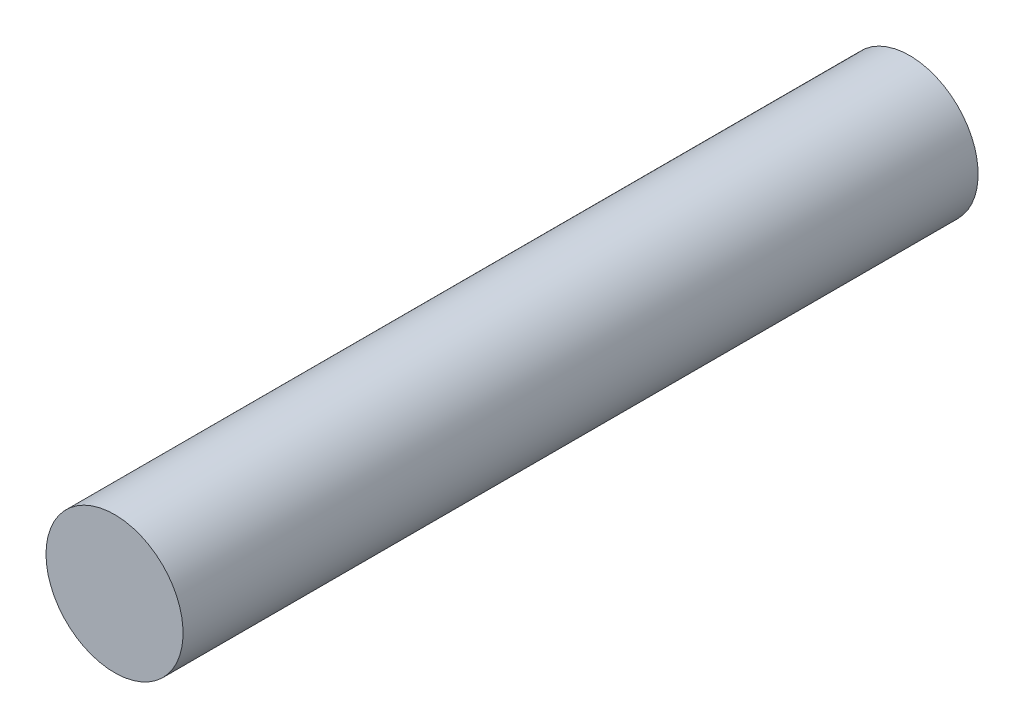
ISO-10303-21;
HEADER;
FILE_DESCRIPTION(('STEP AP214'),'2;1');
FILE_NAME('part.step','',(''),(''),'','','');
FILE_SCHEMA(('AUTOMOTIVE_DESIGN { 1 0 10303 214 1 1 1 1 }'));
ENDSEC;
DATA;
#1=APPLICATION_CONTEXT('core data for automotive mechanical design processes');
#2=APPLICATION_PROTOCOL_DEFINITION('international standard','automotive_design',2000,#1);
#3=PRODUCT_CONTEXT('',#1,'mechanical');
#4=PRODUCT('Part','Part','',(#3));
#5=PRODUCT_RELATED_PRODUCT_CATEGORY('part','',(#4));
#6=PRODUCT_DEFINITION_FORMATION('','',#4);
#7=PRODUCT_DEFINITION_CONTEXT('part definition',#1,'design');
#8=PRODUCT_DEFINITION('design','',#6,#7);
#9=PRODUCT_DEFINITION_SHAPE('','',#8);
#10=(LENGTH_UNIT() NAMED_UNIT(*) SI_UNIT(.MILLI.,.METRE.));
#11=(NAMED_UNIT(*) PLANE_ANGLE_UNIT() SI_UNIT($,.RADIAN.));
#12=(NAMED_UNIT(*) SI_UNIT($,.STERADIAN.) SOLID_ANGLE_UNIT());
#13=UNCERTAINTY_MEASURE_WITH_UNIT(LENGTH_MEASURE(1.E-05),#10,'distance_accuracy_value','');
#14=(GEOMETRIC_REPRESENTATION_CONTEXT(3) GLOBAL_UNCERTAINTY_ASSIGNED_CONTEXT((#13)) GLOBAL_UNIT_ASSIGNED_CONTEXT((#10,
#11,#12)) REPRESENTATION_CONTEXT('',''));
#15=CARTESIAN_POINT('',(0.,0.,0.));
#16=DIRECTION('',(0.,0.,1.));
#17=DIRECTION('',(1.,0.,0.));
#18=AXIS2_PLACEMENT_3D('',#15,#16,#17);
#19=CARTESIAN_POINT('',(0.,0.,58.));
#20=DIRECTION('',(0.,0.,-1.));
#21=DIRECTION('',(-1.,0.,0.));
#22=AXIS2_PLACEMENT_3D('',#19,#20,#21);
#23=CYLINDRICAL_SURFACE('',#22,5.);
#24=CARTESIAN_POINT('',(0.,0.,58.));
#25=DIRECTION('',(0.,0.,1.));
#26=DIRECTION('',(1.,0.,0.));
#27=AXIS2_PLACEMENT_3D('',#24,#25,#26);
#28=CIRCLE('',#27,5.);
#29=CARTESIAN_POINT('',(-5.,0.,58.));
#30=VERTEX_POINT('',#29);
#31=EDGE_CURVE('E10',#30,#30,#28,.T.);
#32=CARTESIAN_POINT('',(0.,0.,0.));
#33=DIRECTION('',(0.,0.,1.));
#34=DIRECTION('',(1.,0.,0.));
#35=AXIS2_PLACEMENT_3D('',#32,#33,#34);
#36=CIRCLE('',#35,5.);
#37=CARTESIAN_POINT('',(-5.,0.,0.));
#38=VERTEX_POINT('',#37);
#39=EDGE_CURVE('E46',#38,#38,#36,.T.);
#40=CARTESIAN_POINT('',(-5.,0.,58.));
#41=CARTESIAN_POINT('',(-5.,0.,57.3958333333333));
#42=CARTESIAN_POINT('',(-5.,0.,56.7916666666667));
#43=CARTESIAN_POINT('',(-5.,0.,55.5833333333333));
#44=CARTESIAN_POINT('',(-5.,0.,54.9791666666667));
#45=CARTESIAN_POINT('',(-5.,0.,53.7708333333333));
#46=CARTESIAN_POINT('',(-5.,0.,53.1666666666667));
#47=CARTESIAN_POINT('',(-5.,0.,51.9583333333333));
#48=CARTESIAN_POINT('',(-5.,0.,51.3541666666667));
#49=CARTESIAN_POINT('',(-5.,0.,50.1458333333333));
#50=CARTESIAN_POINT('',(-5.,0.,49.5416666666667));
#51=CARTESIAN_POINT('',(-5.,0.,48.3333333333333));
#52=CARTESIAN_POINT('',(-5.,0.,47.7291666666667));
#53=CARTESIAN_POINT('',(-5.,0.,46.5208333333333));
#54=CARTESIAN_POINT('',(-5.,0.,45.9166666666667));
#55=CARTESIAN_POINT('',(-5.,0.,44.7083333333333));
#56=CARTESIAN_POINT('',(-5.,0.,44.1041666666667));
#57=CARTESIAN_POINT('',(-5.,0.,42.8958333333333));
#58=CARTESIAN_POINT('',(-5.,0.,42.2916666666667));
#59=CARTESIAN_POINT('',(-5.,0.,41.0833333333333));
#60=CARTESIAN_POINT('',(-5.,0.,40.4791666666667));
#61=CARTESIAN_POINT('',(-5.,0.,39.2708333333333));
#62=CARTESIAN_POINT('',(-5.,0.,38.6666666666667));
#63=CARTESIAN_POINT('',(-5.,0.,37.4583333333333));
#64=CARTESIAN_POINT('',(-5.,0.,36.8541666666667));
#65=CARTESIAN_POINT('',(-5.,0.,35.6458333333333));
#66=CARTESIAN_POINT('',(-5.,0.,35.0416666666667));
#67=CARTESIAN_POINT('',(-5.,0.,33.8333333333333));
#68=CARTESIAN_POINT('',(-5.,0.,33.2291666666667));
#69=CARTESIAN_POINT('',(-5.,0.,32.0208333333333));
#70=CARTESIAN_POINT('',(-5.,0.,31.4166666666667));
#71=CARTESIAN_POINT('',(-5.,0.,30.2083333333333));
#72=CARTESIAN_POINT('',(-5.,0.,29.6041666666667));
#73=CARTESIAN_POINT('',(-5.,0.,28.3958333333333));
#74=CARTESIAN_POINT('',(-5.,0.,27.7916666666667));
#75=CARTESIAN_POINT('',(-5.,0.,26.5833333333333));
#76=CARTESIAN_POINT('',(-5.,0.,25.9791666666667));
#77=CARTESIAN_POINT('',(-5.,0.,24.7708333333333));
#78=CARTESIAN_POINT('',(-5.,0.,24.1666666666667));
#79=CARTESIAN_POINT('',(-5.,0.,22.9583333333333));
#80=CARTESIAN_POINT('',(-5.,0.,22.3541666666667));
#81=CARTESIAN_POINT('',(-5.,0.,21.1458333333333));
#82=CARTESIAN_POINT('',(-5.,0.,20.5416666666667));
#83=CARTESIAN_POINT('',(-5.,0.,19.3333333333333));
#84=CARTESIAN_POINT('',(-5.,0.,18.7291666666667));
#85=CARTESIAN_POINT('',(-5.,0.,17.5208333333333));
#86=CARTESIAN_POINT('',(-5.,0.,16.9166666666667));
#87=CARTESIAN_POINT('',(-5.,0.,15.7083333333333));
#88=CARTESIAN_POINT('',(-5.,0.,15.1041666666667));
#89=CARTESIAN_POINT('',(-5.,0.,13.8958333333333));
#90=CARTESIAN_POINT('',(-5.,0.,13.2916666666667));
#91=CARTESIAN_POINT('',(-5.,0.,12.0833333333333));
#92=CARTESIAN_POINT('',(-5.,0.,11.4791666666667));
#93=CARTESIAN_POINT('',(-5.,0.,10.2708333333333));
#94=CARTESIAN_POINT('',(-5.,0.,9.66666666666667));
#95=CARTESIAN_POINT('',(-5.,0.,8.45833333333333));
#96=CARTESIAN_POINT('',(-5.,0.,7.85416666666667));
#97=CARTESIAN_POINT('',(-5.,0.,6.64583333333333));
#98=CARTESIAN_POINT('',(-5.,0.,6.04166666666667));
#99=CARTESIAN_POINT('',(-5.,0.,4.83333333333333));
#100=CARTESIAN_POINT('',(-5.,0.,4.22916666666667));
#101=CARTESIAN_POINT('',(-5.,0.,3.02083333333334));
#102=CARTESIAN_POINT('',(-5.,0.,2.41666666666667));
#103=CARTESIAN_POINT('',(-5.,0.,1.20833333333333));
#104=CARTESIAN_POINT('',(-5.,0.,0.604166666666666));
#105=CARTESIAN_POINT('',(-5.,0.,0.));
#106=B_SPLINE_CURVE_WITH_KNOTS('',3,(#40,#41,#42,#43,#44,#45,#46,#47,#48,#49,#50,#51,#52,#53,
#54,#55,#56,#57,#58,#59,#60,#61,#62,#63,#64,#65,#66,#67,#68,#69,#70,#71,#72,#73,#74,#75,#76,#77,
#78,#79,#80,#81,#82,#83,#84,#85,#86,#87,#88,#89,#90,#91,#92,#93,#94,#95,#96,#97,#98,#99,#100,
#101,#102,#103,#104,#105),.UNSPECIFIED.,.F.,.F.,(4,2,2,2,2,2,2,2,2,2,2,2,2,2,2,2,2,2,2,2,2,2,2,
2,2,2,2,2,2,2,2,2,4),(0.,1.81249999999999,3.625,5.4375,7.24999999999999,9.06249999999999,10.875,
12.6875,14.5,16.3125,18.125,19.9375,21.75,23.5625,25.375,27.1875,29.,30.8125,32.625,34.4375,
36.25,38.0625,39.875,41.6875,43.5,45.3125,47.125,48.9375,50.75,52.5625,54.375,56.1875,58.),.UNSPECIFIED.);
#107=EDGE_CURVE('BSEAM43',#30,#38,#106,.T.);
#108=ORIENTED_EDGE('',*,*,#31,.F.);
#109=ORIENTED_EDGE('',*,*,#39,.T.);
#110=ORIENTED_EDGE('',*,*,#107,.T.);
#111=ORIENTED_EDGE('',*,*,#107,.F.);
#112=EDGE_LOOP('',(#108,#110,#109,#111));
#113=FACE_BOUND('',#112,.T.);
#114=ADVANCED_FACE('F43',(#113),#23,.T.);
#115=CARTESIAN_POINT('',(0.,0.,58.));
#116=DIRECTION('',(0.,0.,1.));
#117=DIRECTION('',(1.,0.,0.));
#118=AXIS2_PLACEMENT_3D('',#115,#116,#117);
#119=PLANE('',#118);
#120=ORIENTED_EDGE('',*,*,#31,.T.);
#121=EDGE_LOOP('',(#120));
#122=FACE_BOUND('',#121,.T.);
#123=ADVANCED_FACE('F60',(#122),#119,.T.);
#124=CARTESIAN_POINT('',(0.,0.,0.));
#125=DIRECTION('',(0.,0.,1.));
#126=DIRECTION('',(1.,0.,0.));
#127=AXIS2_PLACEMENT_3D('',#124,#125,#126);
#128=PLANE('',#127);
#129=ORIENTED_EDGE('',*,*,#39,.F.);
#130=EDGE_LOOP('',(#129));
#131=FACE_BOUND('',#130,.T.);
#132=ADVANCED_FACE('F58',(#131),#128,.F.);
#133=CLOSED_SHELL('',(#114,#123,#132));
#134=MANIFOLD_SOLID_BREP('B2',#133);
#135=ADVANCED_BREP_SHAPE_REPRESENTATION('',(#18,#134),#14);
#136=SHAPE_DEFINITION_REPRESENTATION(#9,#135);
ENDSEC;
END-ISO-10303-21;
